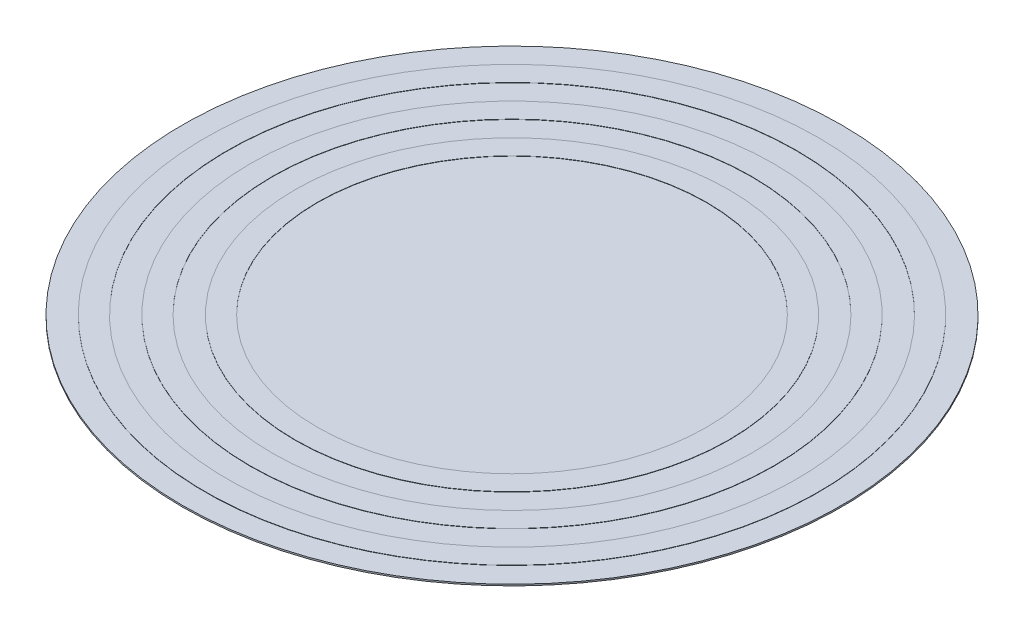
ISO-10303-21;
HEADER;
FILE_DESCRIPTION(('STEP AP214'),'2;1');
FILE_NAME('part.step','',(''),(''),'','','');
FILE_SCHEMA(('AUTOMOTIVE_DESIGN { 1 0 10303 214 1 1 1 1 }'));
ENDSEC;
DATA;
#1=APPLICATION_CONTEXT('core data for automotive mechanical design processes');
#2=APPLICATION_PROTOCOL_DEFINITION('international standard','automotive_design',2000,#1);
#3=PRODUCT_CONTEXT('',#1,'mechanical');
#4=PRODUCT('Part','Part','',(#3));
#5=PRODUCT_RELATED_PRODUCT_CATEGORY('part','',(#4));
#6=PRODUCT_DEFINITION_FORMATION('','',#4);
#7=PRODUCT_DEFINITION_CONTEXT('part definition',#1,'design');
#8=PRODUCT_DEFINITION('design','',#6,#7);
#9=PRODUCT_DEFINITION_SHAPE('','',#8);
#10=(LENGTH_UNIT() NAMED_UNIT(*) SI_UNIT(.MILLI.,.METRE.));
#11=(NAMED_UNIT(*) PLANE_ANGLE_UNIT() SI_UNIT($,.RADIAN.));
#12=(NAMED_UNIT(*) SI_UNIT($,.STERADIAN.) SOLID_ANGLE_UNIT());
#13=UNCERTAINTY_MEASURE_WITH_UNIT(LENGTH_MEASURE(1.E-05),#10,'distance_accuracy_value','');
#14=(GEOMETRIC_REPRESENTATION_CONTEXT(3) GLOBAL_UNCERTAINTY_ASSIGNED_CONTEXT((#13)) GLOBAL_UNIT_ASSIGNED_CONTEXT((#10,
#11,#12)) REPRESENTATION_CONTEXT('',''));
#15=CARTESIAN_POINT('',(0.,0.,0.));
#16=DIRECTION('',(0.,0.,1.));
#17=DIRECTION('',(1.,0.,0.));
#18=AXIS2_PLACEMENT_3D('',#15,#16,#17);
#19=CARTESIAN_POINT('',(0.,0.05,0.));
#20=DIRECTION('',(0.,1.,0.));
#21=DIRECTION('',(0.,0.,1.));
#22=AXIS2_PLACEMENT_3D('',#19,#20,#21);
#23=PLANE('',#22);
#24=CARTESIAN_POINT('',(0.,0.05,0.));
#25=DIRECTION('',(0.,1.,0.));
#26=DIRECTION('',(1.,0.,0.));
#27=AXIS2_PLACEMENT_3D('',#24,#25,#26);
#28=CIRCLE('',#27,8.7366);
#29=CARTESIAN_POINT('',(0.,0.05,-8.7366));
#30=VERTEX_POINT('',#29);
#31=EDGE_CURVE('E73',#30,#30,#28,.T.);
#32=ORIENTED_EDGE('',*,*,#31,.F.);
#33=EDGE_LOOP('',(#32));
#34=FACE_BOUND('',#33,.T.);
#35=CARTESIAN_POINT('',(0.,0.05,0.));
#36=DIRECTION('',(0.,1.,0.));
#37=DIRECTION('',(0.,0.,1.));
#38=AXIS2_PLACEMENT_3D('',#35,#36,#37);
#39=CIRCLE('',#38,9.5);
#40=CARTESIAN_POINT('',(0.,0.05,-9.5));
#41=VERTEX_POINT('',#40);
#42=EDGE_CURVE('E56',#41,#41,#39,.F.);
#43=ORIENTED_EDGE('',*,*,#42,.F.);
#44=EDGE_LOOP('',(#43));
#45=FACE_BOUND('',#44,.T.);
#46=ADVANCED_FACE('F49',(#34,#45),#23,.T.);
#47=CARTESIAN_POINT('',(0.,0.06,0.));
#48=DIRECTION('',(0.,1.,0.));
#49=DIRECTION('',(0.,0.,1.));
#50=AXIS2_PLACEMENT_3D('',#47,#48,#49);
#51=PLANE('',#50);
#52=CARTESIAN_POINT('',(0.,0.06,0.));
#53=DIRECTION('',(0.,1.,0.));
#54=DIRECTION('',(1.,0.,0.));
#55=AXIS2_PLACEMENT_3D('',#52,#53,#54);
#56=CIRCLE('',#55,8.7366);
#57=CARTESIAN_POINT('',(0.,0.06,-8.7366));
#58=VERTEX_POINT('',#57);
#59=EDGE_CURVE('E70',#58,#58,#56,.T.);
#60=ORIENTED_EDGE('',*,*,#59,.T.);
#61=EDGE_LOOP('',(#60));
#62=FACE_BOUND('',#61,.T.);
#63=CARTESIAN_POINT('',(0.,0.06,0.));
#64=DIRECTION('',(0.,1.,0.));
#65=DIRECTION('',(0.,0.,1.));
#66=AXIS2_PLACEMENT_3D('',#63,#64,#65);
#67=CIRCLE('',#66,8.);
#68=CARTESIAN_POINT('',(0.,0.06,-8.));
#69=VERTEX_POINT('',#68);
#70=EDGE_CURVE('E76',#69,#69,#67,.T.);
#71=ORIENTED_EDGE('',*,*,#70,.F.);
#72=EDGE_LOOP('',(#71));
#73=FACE_BOUND('',#72,.T.);
#74=ADVANCED_FACE('F120',(#62,#73),#51,.T.);
#75=CARTESIAN_POINT('',(0.,0.06,0.));
#76=DIRECTION('',(0.,-1.,0.));
#77=DIRECTION('',(0.,0.,-1.));
#78=AXIS2_PLACEMENT_3D('',#75,#76,#77);
#79=CYLINDRICAL_SURFACE('',#78,8.7366);
#80=CARTESIAN_POINT('',(0.,0.06,-8.7366));
#81=CARTESIAN_POINT('',(0.,0.0598958333333333,-8.7366));
#82=CARTESIAN_POINT('',(0.,0.0597916666666667,-8.7366));
#83=CARTESIAN_POINT('',(0.,0.0595833333333333,-8.7366));
#84=CARTESIAN_POINT('',(0.,0.0594791666666667,-8.7366));
#85=CARTESIAN_POINT('',(0.,0.0592708333333333,-8.7366));
#86=CARTESIAN_POINT('',(0.,0.0591666666666667,-8.7366));
#87=CARTESIAN_POINT('',(0.,0.0589583333333333,-8.7366));
#88=CARTESIAN_POINT('',(0.,0.0588541666666667,-8.7366));
#89=CARTESIAN_POINT('',(0.,0.0586458333333333,-8.7366));
#90=CARTESIAN_POINT('',(0.,0.0585416666666667,-8.7366));
#91=CARTESIAN_POINT('',(0.,0.0583333333333333,-8.7366));
#92=CARTESIAN_POINT('',(0.,0.0582291666666667,-8.7366));
#93=CARTESIAN_POINT('',(0.,0.0580208333333333,-8.7366));
#94=CARTESIAN_POINT('',(0.,0.0579166666666667,-8.7366));
#95=CARTESIAN_POINT('',(0.,0.0577083333333333,-8.7366));
#96=CARTESIAN_POINT('',(0.,0.0576041666666667,-8.7366));
#97=CARTESIAN_POINT('',(0.,0.0573958333333333,-8.7366));
#98=CARTESIAN_POINT('',(0.,0.0572916666666667,-8.7366));
#99=CARTESIAN_POINT('',(0.,0.0570833333333333,-8.7366));
#100=CARTESIAN_POINT('',(0.,0.0569791666666667,-8.7366));
#101=CARTESIAN_POINT('',(0.,0.0567708333333333,-8.7366));
#102=CARTESIAN_POINT('',(0.,0.0566666666666667,-8.7366));
#103=CARTESIAN_POINT('',(0.,0.0564583333333333,-8.7366));
#104=CARTESIAN_POINT('',(0.,0.0563541666666667,-8.7366));
#105=CARTESIAN_POINT('',(0.,0.0561458333333333,-8.7366));
#106=CARTESIAN_POINT('',(0.,0.0560416666666667,-8.7366));
#107=CARTESIAN_POINT('',(0.,0.0558333333333333,-8.7366));
#108=CARTESIAN_POINT('',(0.,0.0557291666666667,-8.7366));
#109=CARTESIAN_POINT('',(0.,0.0555208333333333,-8.7366));
#110=CARTESIAN_POINT('',(0.,0.0554166666666667,-8.7366));
#111=CARTESIAN_POINT('',(0.,0.0552083333333333,-8.7366));
#112=CARTESIAN_POINT('',(0.,0.0551041666666667,-8.7366));
#113=CARTESIAN_POINT('',(0.,0.0548958333333333,-8.7366));
#114=CARTESIAN_POINT('',(0.,0.0547916666666667,-8.7366));
#115=CARTESIAN_POINT('',(0.,0.0545833333333333,-8.7366));
#116=CARTESIAN_POINT('',(0.,0.0544791666666667,-8.7366));
#117=CARTESIAN_POINT('',(0.,0.0542708333333333,-8.7366));
#118=CARTESIAN_POINT('',(0.,0.0541666666666667,-8.7366));
#119=CARTESIAN_POINT('',(0.,0.0539583333333333,-8.7366));
#120=CARTESIAN_POINT('',(0.,0.0538541666666667,-8.7366));
#121=CARTESIAN_POINT('',(0.,0.0536458333333333,-8.7366));
#122=CARTESIAN_POINT('',(0.,0.0535416666666667,-8.7366));
#123=CARTESIAN_POINT('',(0.,0.0533333333333333,-8.7366));
#124=CARTESIAN_POINT('',(0.,0.0532291666666667,-8.7366));
#125=CARTESIAN_POINT('',(0.,0.0530208333333333,-8.7366));
#126=CARTESIAN_POINT('',(0.,0.0529166666666667,-8.7366));
#127=CARTESIAN_POINT('',(0.,0.0527083333333333,-8.7366));
#128=CARTESIAN_POINT('',(0.,0.0526041666666667,-8.7366));
#129=CARTESIAN_POINT('',(0.,0.0523958333333333,-8.7366));
#130=CARTESIAN_POINT('',(0.,0.0522916666666667,-8.7366));
#131=CARTESIAN_POINT('',(0.,0.0520833333333333,-8.7366));
#132=CARTESIAN_POINT('',(0.,0.0519791666666667,-8.7366));
#133=CARTESIAN_POINT('',(0.,0.0517708333333333,-8.7366));
#134=CARTESIAN_POINT('',(0.,0.0516666666666667,-8.7366));
#135=CARTESIAN_POINT('',(0.,0.0514583333333333,-8.7366));
#136=CARTESIAN_POINT('',(0.,0.0513541666666667,-8.7366));
#137=CARTESIAN_POINT('',(0.,0.0511458333333333,-8.7366));
#138=CARTESIAN_POINT('',(0.,0.0510416666666667,-8.7366));
#139=CARTESIAN_POINT('',(0.,0.0508333333333333,-8.7366));
#140=CARTESIAN_POINT('',(0.,0.0507291666666667,-8.7366));
#141=CARTESIAN_POINT('',(0.,0.0505208333333333,-8.7366));
#142=CARTESIAN_POINT('',(0.,0.0504166666666667,-8.7366));
#143=CARTESIAN_POINT('',(0.,0.0502083333333333,-8.7366));
#144=CARTESIAN_POINT('',(0.,0.0501041666666667,-8.7366));
#145=CARTESIAN_POINT('',(0.,0.05,-8.7366));
#146=B_SPLINE_CURVE_WITH_KNOTS('',3,(#80,#81,#82,#83,#84,#85,#86,#87,#88,#89,#90,#91,#92,#93,
#94,#95,#96,#97,#98,#99,#100,#101,#102,#103,#104,#105,#106,#107,#108,#109,#110,#111,#112,#113,
#114,#115,#116,#117,#118,#119,#120,#121,#122,#123,#124,#125,#126,#127,#128,#129,#130,#131,#132,
#133,#134,#135,#136,#137,#138,#139,#140,#141,#142,#143,#144,#145),.UNSPECIFIED.,.F.,.F.,(4,2,2,
2,2,2,2,2,2,2,2,2,2,2,2,2,2,2,2,2,2,2,2,2,2,2,2,2,2,2,2,2,4),(0.,0.000312500000000001,
0.000625000000000002,0.000937500000000002,0.00125,0.0015625,0.001875,0.00218750000000001,0.0025,
0.0028125,0.003125,0.0034375,0.00375,0.0040625,0.004375,0.00468750000000001,0.005,0.0053125,
0.005625,0.0059375,0.00625,0.0065625,0.006875,0.0071875,0.0075,0.0078125,0.008125,0.0084375,
0.00875,0.0090625,0.009375,0.0096875,0.01),.UNSPECIFIED.);
#147=EDGE_CURVE('BSEAM125',#58,#30,#146,.T.);
#148=ORIENTED_EDGE('',*,*,#59,.F.);
#149=ORIENTED_EDGE('',*,*,#31,.T.);
#150=ORIENTED_EDGE('',*,*,#147,.T.);
#151=ORIENTED_EDGE('',*,*,#147,.F.);
#152=EDGE_LOOP('',(#148,#150,#149,#151));
#153=FACE_BOUND('',#152,.T.);
#154=ADVANCED_FACE('F125',(#153),#79,.T.);
#155=CARTESIAN_POINT('',(0.,0.06,0.));
#156=DIRECTION('',(0.,-1.,0.));
#157=DIRECTION('',(0.,0.,-1.));
#158=AXIS2_PLACEMENT_3D('',#155,#156,#157);
#159=CYLINDRICAL_SURFACE('',#158,8.);
#160=CARTESIAN_POINT('',(0.,0.05,0.));
#161=DIRECTION('',(0.,1.,0.));
#162=DIRECTION('',(0.,0.,1.));
#163=AXIS2_PLACEMENT_3D('',#160,#161,#162);
#164=CIRCLE('',#163,8.);
#165=CARTESIAN_POINT('',(0.,0.05,-8.));
#166=VERTEX_POINT('',#165);
#167=EDGE_CURVE('E60',#166,#166,#164,.F.);
#168=CARTESIAN_POINT('',(0.,0.06,-8.));
#169=CARTESIAN_POINT('',(0.,0.0598958333333333,-8.));
#170=CARTESIAN_POINT('',(0.,0.0597916666666667,-8.));
#171=CARTESIAN_POINT('',(0.,0.0595833333333333,-8.));
#172=CARTESIAN_POINT('',(0.,0.0594791666666667,-8.));
#173=CARTESIAN_POINT('',(0.,0.0592708333333333,-8.));
#174=CARTESIAN_POINT('',(0.,0.0591666666666667,-8.));
#175=CARTESIAN_POINT('',(0.,0.0589583333333333,-8.));
#176=CARTESIAN_POINT('',(0.,0.0588541666666667,-8.));
#177=CARTESIAN_POINT('',(0.,0.0586458333333333,-8.));
#178=CARTESIAN_POINT('',(0.,0.0585416666666667,-8.));
#179=CARTESIAN_POINT('',(0.,0.0583333333333333,-8.));
#180=CARTESIAN_POINT('',(0.,0.0582291666666667,-8.));
#181=CARTESIAN_POINT('',(0.,0.0580208333333333,-8.));
#182=CARTESIAN_POINT('',(0.,0.0579166666666667,-8.));
#183=CARTESIAN_POINT('',(0.,0.0577083333333333,-8.));
#184=CARTESIAN_POINT('',(0.,0.0576041666666667,-8.));
#185=CARTESIAN_POINT('',(0.,0.0573958333333333,-8.));
#186=CARTESIAN_POINT('',(0.,0.0572916666666667,-8.));
#187=CARTESIAN_POINT('',(0.,0.0570833333333333,-8.));
#188=CARTESIAN_POINT('',(0.,0.0569791666666667,-8.));
#189=CARTESIAN_POINT('',(0.,0.0567708333333333,-8.));
#190=CARTESIAN_POINT('',(0.,0.0566666666666667,-8.));
#191=CARTESIAN_POINT('',(0.,0.0564583333333333,-8.));
#192=CARTESIAN_POINT('',(0.,0.0563541666666667,-8.));
#193=CARTESIAN_POINT('',(0.,0.0561458333333333,-8.));
#194=CARTESIAN_POINT('',(0.,0.0560416666666667,-8.));
#195=CARTESIAN_POINT('',(0.,0.0558333333333333,-8.));
#196=CARTESIAN_POINT('',(0.,0.0557291666666667,-8.));
#197=CARTESIAN_POINT('',(0.,0.0555208333333333,-8.));
#198=CARTESIAN_POINT('',(0.,0.0554166666666667,-8.));
#199=CARTESIAN_POINT('',(0.,0.0552083333333333,-8.));
#200=CARTESIAN_POINT('',(0.,0.0551041666666667,-8.));
#201=CARTESIAN_POINT('',(0.,0.0548958333333333,-8.));
#202=CARTESIAN_POINT('',(0.,0.0547916666666667,-8.));
#203=CARTESIAN_POINT('',(0.,0.0545833333333333,-8.));
#204=CARTESIAN_POINT('',(0.,0.0544791666666667,-8.));
#205=CARTESIAN_POINT('',(0.,0.0542708333333333,-8.));
#206=CARTESIAN_POINT('',(0.,0.0541666666666667,-8.));
#207=CARTESIAN_POINT('',(0.,0.0539583333333333,-8.));
#208=CARTESIAN_POINT('',(0.,0.0538541666666667,-8.));
#209=CARTESIAN_POINT('',(0.,0.0536458333333333,-8.));
#210=CARTESIAN_POINT('',(0.,0.0535416666666667,-8.));
#211=CARTESIAN_POINT('',(0.,0.0533333333333333,-8.));
#212=CARTESIAN_POINT('',(0.,0.0532291666666667,-8.));
#213=CARTESIAN_POINT('',(0.,0.0530208333333333,-8.));
#214=CARTESIAN_POINT('',(0.,0.0529166666666667,-8.));
#215=CARTESIAN_POINT('',(0.,0.0527083333333333,-8.));
#216=CARTESIAN_POINT('',(0.,0.0526041666666667,-8.));
#217=CARTESIAN_POINT('',(0.,0.0523958333333333,-8.));
#218=CARTESIAN_POINT('',(0.,0.0522916666666667,-8.));
#219=CARTESIAN_POINT('',(0.,0.0520833333333333,-8.));
#220=CARTESIAN_POINT('',(0.,0.0519791666666667,-8.));
#221=CARTESIAN_POINT('',(0.,0.0517708333333333,-8.));
#222=CARTESIAN_POINT('',(0.,0.0516666666666667,-8.));
#223=CARTESIAN_POINT('',(0.,0.0514583333333333,-8.));
#224=CARTESIAN_POINT('',(0.,0.0513541666666667,-8.));
#225=CARTESIAN_POINT('',(0.,0.0511458333333333,-8.));
#226=CARTESIAN_POINT('',(0.,0.0510416666666667,-8.));
#227=CARTESIAN_POINT('',(0.,0.0508333333333333,-8.));
#228=CARTESIAN_POINT('',(0.,0.0507291666666667,-8.));
#229=CARTESIAN_POINT('',(0.,0.0505208333333333,-8.));
#230=CARTESIAN_POINT('',(0.,0.0504166666666667,-8.));
#231=CARTESIAN_POINT('',(0.,0.0502083333333333,-8.));
#232=CARTESIAN_POINT('',(0.,0.0501041666666667,-8.));
#233=CARTESIAN_POINT('',(0.,0.05,-8.));
#234=B_SPLINE_CURVE_WITH_KNOTS('',3,(#168,#169,#170,#171,#172,#173,#174,#175,#176,#177,#178,
#179,#180,#181,#182,#183,#184,#185,#186,#187,#188,#189,#190,#191,#192,#193,#194,#195,#196,#197,
#198,#199,#200,#201,#202,#203,#204,#205,#206,#207,#208,#209,#210,#211,#212,#213,#214,#215,#216,
#217,#218,#219,#220,#221,#222,#223,#224,#225,#226,#227,#228,#229,#230,#231,#232,#233),
.UNSPECIFIED.,.F.,.F.,(4,2,2,2,2,2,2,2,2,2,2,2,2,2,2,2,2,2,2,2,2,2,2,2,2,2,2,2,2,2,2,2,4),(0.,
0.000312500000000001,0.000625000000000002,0.000937500000000002,0.00125,0.0015625,0.001875,
0.00218750000000001,0.0025,0.0028125,0.003125,0.0034375,0.00375,0.0040625,0.004375,
0.00468750000000001,0.005,0.0053125,0.005625,0.0059375,0.00625,0.0065625,0.006875,0.0071875,
0.0075,0.0078125,0.008125,0.0084375,0.00875,0.0090625,0.009375,0.0096875,0.01),.UNSPECIFIED.);
#235=EDGE_CURVE('BSEAM133',#69,#166,#234,.T.);
#236=ORIENTED_EDGE('',*,*,#70,.T.);
#237=ORIENTED_EDGE('',*,*,#167,.T.);
#238=ORIENTED_EDGE('',*,*,#235,.T.);
#239=ORIENTED_EDGE('',*,*,#235,.F.);
#240=EDGE_LOOP('',(#236,#238,#237,#239));
#241=FACE_BOUND('',#240,.T.);
#242=ADVANCED_FACE('F133',(#241),#159,.F.);
#243=CARTESIAN_POINT('',(0.,0.05,0.));
#244=DIRECTION('',(0.,1.,0.));
#245=DIRECTION('',(1.,0.,0.));
#246=AXIS2_PLACEMENT_3D('',#243,#244,#245);
#247=CIRCLE('',#246,7.2366);
#248=CARTESIAN_POINT('',(0.,0.05,-7.2366));
#249=VERTEX_POINT('',#248);
#250=EDGE_CURVE('E91',#249,#249,#247,.T.);
#251=ORIENTED_EDGE('',*,*,#250,.F.);
#252=EDGE_LOOP('',(#251));
#253=FACE_BOUND('',#252,.T.);
#254=ORIENTED_EDGE('',*,*,#167,.F.);
#255=EDGE_LOOP('',(#254));
#256=FACE_BOUND('',#255,.T.);
#257=ADVANCED_FACE('F117',(#253,#256),#23,.T.);
#258=CARTESIAN_POINT('',(0.,0.06,0.));
#259=DIRECTION('',(0.,1.,0.));
#260=DIRECTION('',(0.,0.,1.));
#261=AXIS2_PLACEMENT_3D('',#258,#259,#260);
#262=PLANE('',#261);
#263=CARTESIAN_POINT('',(0.,0.06,0.));
#264=DIRECTION('',(0.,1.,0.));
#265=DIRECTION('',(1.,0.,0.));
#266=AXIS2_PLACEMENT_3D('',#263,#264,#265);
#267=CIRCLE('',#266,10.2366);
#268=CARTESIAN_POINT('',(0.,0.06,-10.2366));
#269=VERTEX_POINT('',#268);
#270=EDGE_CURVE('E81',#269,#269,#267,.T.);
#271=ORIENTED_EDGE('',*,*,#270,.T.);
#272=EDGE_LOOP('',(#271));
#273=FACE_BOUND('',#272,.T.);
#274=CARTESIAN_POINT('',(0.,0.06,0.));
#275=DIRECTION('',(0.,1.,0.));
#276=DIRECTION('',(0.,0.,1.));
#277=AXIS2_PLACEMENT_3D('',#274,#275,#276);
#278=CIRCLE('',#277,9.5);
#279=CARTESIAN_POINT('',(0.,0.06,-9.5));
#280=VERTEX_POINT('',#279);
#281=EDGE_CURVE('E85',#280,#280,#278,.T.);
#282=ORIENTED_EDGE('',*,*,#281,.F.);
#283=EDGE_LOOP('',(#282));
#284=FACE_BOUND('',#283,.T.);
#285=ADVANCED_FACE('F132',(#273,#284),#262,.T.);
#286=CARTESIAN_POINT('',(0.,0.06,0.));
#287=DIRECTION('',(0.,-1.,0.));
#288=DIRECTION('',(0.,0.,-1.));
#289=AXIS2_PLACEMENT_3D('',#286,#287,#288);
#290=CYLINDRICAL_SURFACE('',#289,10.2366);
#291=CARTESIAN_POINT('',(0.,0.05,0.));
#292=DIRECTION('',(0.,1.,0.));
#293=DIRECTION('',(1.,0.,0.));
#294=AXIS2_PLACEMENT_3D('',#291,#292,#293);
#295=CIRCLE('',#294,10.2366);
#296=CARTESIAN_POINT('',(0.,0.05,-10.2366));
#297=VERTEX_POINT('',#296);
#298=EDGE_CURVE('E82',#297,#297,#295,.T.);
#299=CARTESIAN_POINT('',(0.,0.06,-10.2366));
#300=CARTESIAN_POINT('',(0.,0.0598958333333333,-10.2366));
#301=CARTESIAN_POINT('',(0.,0.0597916666666667,-10.2366));
#302=CARTESIAN_POINT('',(0.,0.0595833333333333,-10.2366));
#303=CARTESIAN_POINT('',(0.,0.0594791666666667,-10.2366));
#304=CARTESIAN_POINT('',(0.,0.0592708333333333,-10.2366));
#305=CARTESIAN_POINT('',(0.,0.0591666666666667,-10.2366));
#306=CARTESIAN_POINT('',(0.,0.0589583333333333,-10.2366));
#307=CARTESIAN_POINT('',(0.,0.0588541666666667,-10.2366));
#308=CARTESIAN_POINT('',(0.,0.0586458333333333,-10.2366));
#309=CARTESIAN_POINT('',(0.,0.0585416666666667,-10.2366));
#310=CARTESIAN_POINT('',(0.,0.0583333333333333,-10.2366));
#311=CARTESIAN_POINT('',(0.,0.0582291666666667,-10.2366));
#312=CARTESIAN_POINT('',(0.,0.0580208333333333,-10.2366));
#313=CARTESIAN_POINT('',(0.,0.0579166666666667,-10.2366));
#314=CARTESIAN_POINT('',(0.,0.0577083333333333,-10.2366));
#315=CARTESIAN_POINT('',(0.,0.0576041666666667,-10.2366));
#316=CARTESIAN_POINT('',(0.,0.0573958333333333,-10.2366));
#317=CARTESIAN_POINT('',(0.,0.0572916666666667,-10.2366));
#318=CARTESIAN_POINT('',(0.,0.0570833333333333,-10.2366));
#319=CARTESIAN_POINT('',(0.,0.0569791666666667,-10.2366));
#320=CARTESIAN_POINT('',(0.,0.0567708333333333,-10.2366));
#321=CARTESIAN_POINT('',(0.,0.0566666666666667,-10.2366));
#322=CARTESIAN_POINT('',(0.,0.0564583333333333,-10.2366));
#323=CARTESIAN_POINT('',(0.,0.0563541666666667,-10.2366));
#324=CARTESIAN_POINT('',(0.,0.0561458333333333,-10.2366));
#325=CARTESIAN_POINT('',(0.,0.0560416666666667,-10.2366));
#326=CARTESIAN_POINT('',(0.,0.0558333333333333,-10.2366));
#327=CARTESIAN_POINT('',(0.,0.0557291666666667,-10.2366));
#328=CARTESIAN_POINT('',(0.,0.0555208333333333,-10.2366));
#329=CARTESIAN_POINT('',(0.,0.0554166666666667,-10.2366));
#330=CARTESIAN_POINT('',(0.,0.0552083333333333,-10.2366));
#331=CARTESIAN_POINT('',(0.,0.0551041666666667,-10.2366));
#332=CARTESIAN_POINT('',(0.,0.0548958333333333,-10.2366));
#333=CARTESIAN_POINT('',(0.,0.0547916666666667,-10.2366));
#334=CARTESIAN_POINT('',(0.,0.0545833333333333,-10.2366));
#335=CARTESIAN_POINT('',(0.,0.0544791666666667,-10.2366));
#336=CARTESIAN_POINT('',(0.,0.0542708333333333,-10.2366));
#337=CARTESIAN_POINT('',(0.,0.0541666666666667,-10.2366));
#338=CARTESIAN_POINT('',(0.,0.0539583333333333,-10.2366));
#339=CARTESIAN_POINT('',(0.,0.0538541666666667,-10.2366));
#340=CARTESIAN_POINT('',(0.,0.0536458333333333,-10.2366));
#341=CARTESIAN_POINT('',(0.,0.0535416666666667,-10.2366));
#342=CARTESIAN_POINT('',(0.,0.0533333333333333,-10.2366));
#343=CARTESIAN_POINT('',(0.,0.0532291666666667,-10.2366));
#344=CARTESIAN_POINT('',(0.,0.0530208333333333,-10.2366));
#345=CARTESIAN_POINT('',(0.,0.0529166666666667,-10.2366));
#346=CARTESIAN_POINT('',(0.,0.0527083333333333,-10.2366));
#347=CARTESIAN_POINT('',(0.,0.0526041666666667,-10.2366));
#348=CARTESIAN_POINT('',(0.,0.0523958333333333,-10.2366));
#349=CARTESIAN_POINT('',(0.,0.0522916666666667,-10.2366));
#350=CARTESIAN_POINT('',(0.,0.0520833333333333,-10.2366));
#351=CARTESIAN_POINT('',(0.,0.0519791666666667,-10.2366));
#352=CARTESIAN_POINT('',(0.,0.0517708333333333,-10.2366));
#353=CARTESIAN_POINT('',(0.,0.0516666666666667,-10.2366));
#354=CARTESIAN_POINT('',(0.,0.0514583333333333,-10.2366));
#355=CARTESIAN_POINT('',(0.,0.0513541666666667,-10.2366));
#356=CARTESIAN_POINT('',(0.,0.0511458333333333,-10.2366));
#357=CARTESIAN_POINT('',(0.,0.0510416666666667,-10.2366));
#358=CARTESIAN_POINT('',(0.,0.0508333333333333,-10.2366));
#359=CARTESIAN_POINT('',(0.,0.0507291666666667,-10.2366));
#360=CARTESIAN_POINT('',(0.,0.0505208333333333,-10.2366));
#361=CARTESIAN_POINT('',(0.,0.0504166666666667,-10.2366));
#362=CARTESIAN_POINT('',(0.,0.0502083333333333,-10.2366));
#363=CARTESIAN_POINT('',(0.,0.0501041666666667,-10.2366));
#364=CARTESIAN_POINT('',(0.,0.05,-10.2366));
#365=B_SPLINE_CURVE_WITH_KNOTS('',3,(#299,#300,#301,#302,#303,#304,#305,#306,#307,#308,#309,
#310,#311,#312,#313,#314,#315,#316,#317,#318,#319,#320,#321,#322,#323,#324,#325,#326,#327,#328,
#329,#330,#331,#332,#333,#334,#335,#336,#337,#338,#339,#340,#341,#342,#343,#344,#345,#346,#347,
#348,#349,#350,#351,#352,#353,#354,#355,#356,#357,#358,#359,#360,#361,#362,#363,#364),
.UNSPECIFIED.,.F.,.F.,(4,2,2,2,2,2,2,2,2,2,2,2,2,2,2,2,2,2,2,2,2,2,2,2,2,2,2,2,2,2,2,2,4),(0.,
0.000312500000000001,0.000625000000000002,0.000937500000000002,0.00125,0.0015625,0.001875,
0.00218750000000001,0.0025,0.0028125,0.003125,0.0034375,0.00375,0.0040625,0.004375,
0.00468750000000001,0.005,0.0053125,0.005625,0.0059375,0.00625,0.0065625,0.006875,0.0071875,
0.0075,0.0078125,0.008125,0.0084375,0.00875,0.0090625,0.009375,0.0096875,0.01),.UNSPECIFIED.);
#366=EDGE_CURVE('BSEAM180',#269,#297,#365,.T.);
#367=ORIENTED_EDGE('',*,*,#270,.F.);
#368=ORIENTED_EDGE('',*,*,#298,.T.);
#369=ORIENTED_EDGE('',*,*,#366,.T.);
#370=ORIENTED_EDGE('',*,*,#366,.F.);
#371=EDGE_LOOP('',(#367,#369,#368,#370));
#372=FACE_BOUND('',#371,.T.);
#373=ADVANCED_FACE('F180',(#372),#290,.T.);
#374=CARTESIAN_POINT('',(0.,0.06,0.));
#375=DIRECTION('',(0.,-1.,0.));
#376=DIRECTION('',(0.,0.,-1.));
#377=AXIS2_PLACEMENT_3D('',#374,#375,#376);
#378=CYLINDRICAL_SURFACE('',#377,9.5);
#379=CARTESIAN_POINT('',(0.,0.06,-9.5));
#380=CARTESIAN_POINT('',(0.,0.0598958333333333,-9.5));
#381=CARTESIAN_POINT('',(0.,0.0597916666666667,-9.5));
#382=CARTESIAN_POINT('',(0.,0.0595833333333333,-9.5));
#383=CARTESIAN_POINT('',(0.,0.0594791666666667,-9.5));
#384=CARTESIAN_POINT('',(0.,0.0592708333333333,-9.5));
#385=CARTESIAN_POINT('',(0.,0.0591666666666667,-9.5));
#386=CARTESIAN_POINT('',(0.,0.0589583333333333,-9.5));
#387=CARTESIAN_POINT('',(0.,0.0588541666666667,-9.5));
#388=CARTESIAN_POINT('',(0.,0.0586458333333333,-9.5));
#389=CARTESIAN_POINT('',(0.,0.0585416666666667,-9.5));
#390=CARTESIAN_POINT('',(0.,0.0583333333333333,-9.5));
#391=CARTESIAN_POINT('',(0.,0.0582291666666667,-9.5));
#392=CARTESIAN_POINT('',(0.,0.0580208333333333,-9.5));
#393=CARTESIAN_POINT('',(0.,0.0579166666666667,-9.5));
#394=CARTESIAN_POINT('',(0.,0.0577083333333333,-9.5));
#395=CARTESIAN_POINT('',(0.,0.0576041666666667,-9.5));
#396=CARTESIAN_POINT('',(0.,0.0573958333333333,-9.5));
#397=CARTESIAN_POINT('',(0.,0.0572916666666667,-9.5));
#398=CARTESIAN_POINT('',(0.,0.0570833333333333,-9.5));
#399=CARTESIAN_POINT('',(0.,0.0569791666666667,-9.5));
#400=CARTESIAN_POINT('',(0.,0.0567708333333333,-9.5));
#401=CARTESIAN_POINT('',(0.,0.0566666666666667,-9.5));
#402=CARTESIAN_POINT('',(0.,0.0564583333333333,-9.5));
#403=CARTESIAN_POINT('',(0.,0.0563541666666667,-9.5));
#404=CARTESIAN_POINT('',(0.,0.0561458333333333,-9.5));
#405=CARTESIAN_POINT('',(0.,0.0560416666666667,-9.5));
#406=CARTESIAN_POINT('',(0.,0.0558333333333333,-9.5));
#407=CARTESIAN_POINT('',(0.,0.0557291666666667,-9.5));
#408=CARTESIAN_POINT('',(0.,0.0555208333333333,-9.5));
#409=CARTESIAN_POINT('',(0.,0.0554166666666667,-9.5));
#410=CARTESIAN_POINT('',(0.,0.0552083333333333,-9.5));
#411=CARTESIAN_POINT('',(0.,0.0551041666666667,-9.5));
#412=CARTESIAN_POINT('',(0.,0.0548958333333333,-9.5));
#413=CARTESIAN_POINT('',(0.,0.0547916666666667,-9.5));
#414=CARTESIAN_POINT('',(0.,0.0545833333333333,-9.5));
#415=CARTESIAN_POINT('',(0.,0.0544791666666667,-9.5));
#416=CARTESIAN_POINT('',(0.,0.0542708333333333,-9.5));
#417=CARTESIAN_POINT('',(0.,0.0541666666666667,-9.5));
#418=CARTESIAN_POINT('',(0.,0.0539583333333333,-9.5));
#419=CARTESIAN_POINT('',(0.,0.0538541666666667,-9.5));
#420=CARTESIAN_POINT('',(0.,0.0536458333333333,-9.5));
#421=CARTESIAN_POINT('',(0.,0.0535416666666667,-9.5));
#422=CARTESIAN_POINT('',(0.,0.0533333333333333,-9.5));
#423=CARTESIAN_POINT('',(0.,0.0532291666666667,-9.5));
#424=CARTESIAN_POINT('',(0.,0.0530208333333333,-9.5));
#425=CARTESIAN_POINT('',(0.,0.0529166666666667,-9.5));
#426=CARTESIAN_POINT('',(0.,0.0527083333333333,-9.5));
#427=CARTESIAN_POINT('',(0.,0.0526041666666667,-9.5));
#428=CARTESIAN_POINT('',(0.,0.0523958333333333,-9.5));
#429=CARTESIAN_POINT('',(0.,0.0522916666666667,-9.5));
#430=CARTESIAN_POINT('',(0.,0.0520833333333333,-9.5));
#431=CARTESIAN_POINT('',(0.,0.0519791666666667,-9.5));
#432=CARTESIAN_POINT('',(0.,0.0517708333333333,-9.5));
#433=CARTESIAN_POINT('',(0.,0.0516666666666667,-9.5));
#434=CARTESIAN_POINT('',(0.,0.0514583333333333,-9.5));
#435=CARTESIAN_POINT('',(0.,0.0513541666666667,-9.5));
#436=CARTESIAN_POINT('',(0.,0.0511458333333333,-9.5));
#437=CARTESIAN_POINT('',(0.,0.0510416666666667,-9.5));
#438=CARTESIAN_POINT('',(0.,0.0508333333333333,-9.5));
#439=CARTESIAN_POINT('',(0.,0.0507291666666667,-9.5));
#440=CARTESIAN_POINT('',(0.,0.0505208333333333,-9.5));
#441=CARTESIAN_POINT('',(0.,0.0504166666666667,-9.5));
#442=CARTESIAN_POINT('',(0.,0.0502083333333333,-9.5));
#443=CARTESIAN_POINT('',(0.,0.0501041666666667,-9.5));
#444=CARTESIAN_POINT('',(0.,0.05,-9.5));
#445=B_SPLINE_CURVE_WITH_KNOTS('',3,(#379,#380,#381,#382,#383,#384,#385,#386,#387,#388,#389,
#390,#391,#392,#393,#394,#395,#396,#397,#398,#399,#400,#401,#402,#403,#404,#405,#406,#407,#408,
#409,#410,#411,#412,#413,#414,#415,#416,#417,#418,#419,#420,#421,#422,#423,#424,#425,#426,#427,
#428,#429,#430,#431,#432,#433,#434,#435,#436,#437,#438,#439,#440,#441,#442,#443,#444),
.UNSPECIFIED.,.F.,.F.,(4,2,2,2,2,2,2,2,2,2,2,2,2,2,2,2,2,2,2,2,2,2,2,2,2,2,2,2,2,2,2,2,4),(0.,
0.000312499999999994,0.000624999999999995,0.000937499999999996,0.00125,0.0015625,0.001875,
0.0021875,0.00249999999999999,0.00281249999999999,0.00312499999999999,0.0034375,0.00375,
0.0040625,0.004375,0.0046875,0.00499999999999999,0.00531249999999999,0.00562499999999999,
0.00593749999999999,0.00625,0.0065625,0.006875,0.00718749999999999,0.00749999999999999,
0.00781249999999999,0.00812499999999999,0.0084375,0.00875,0.0090625,0.009375,
0.00968749999999999,0.00999999999999999),.UNSPECIFIED.);
#446=EDGE_CURVE('BSEAM174',#280,#41,#445,.T.);
#447=ORIENTED_EDGE('',*,*,#281,.T.);
#448=ORIENTED_EDGE('',*,*,#42,.T.);
#449=ORIENTED_EDGE('',*,*,#446,.T.);
#450=ORIENTED_EDGE('',*,*,#446,.F.);
#451=EDGE_LOOP('',(#447,#449,#448,#450));
#452=FACE_BOUND('',#451,.T.);
#453=ADVANCED_FACE('F174',(#452),#378,.F.);
#454=CARTESIAN_POINT('',(0.,0.,0.));
#455=DIRECTION('',(0.,1.,0.));
#456=DIRECTION('',(0.,0.,1.));
#457=AXIS2_PLACEMENT_3D('',#454,#455,#456);
#458=PLANE('',#457);
#459=CARTESIAN_POINT('',(0.,0.,0.));
#460=DIRECTION('',(0.,1.,0.));
#461=DIRECTION('',(0.,0.,1.));
#462=AXIS2_PLACEMENT_3D('',#459,#460,#461);
#463=CIRCLE('',#462,11.);
#464=CARTESIAN_POINT('',(0.,0.,11.));
#465=VERTEX_POINT('',#464);
#466=EDGE_CURVE('E67',#465,#465,#463,.T.);
#467=ORIENTED_EDGE('',*,*,#466,.F.);
#468=EDGE_LOOP('',(#467));
#469=FACE_BOUND('',#468,.T.);
#470=ADVANCED_FACE('F179',(#469),#458,.F.);
#471=CARTESIAN_POINT('',(0.,0.05,0.));
#472=DIRECTION('',(0.,-1.,0.));
#473=DIRECTION('',(0.,0.,-1.));
#474=AXIS2_PLACEMENT_3D('',#471,#472,#473);
#475=CYLINDRICAL_SURFACE('',#474,11.);
#476=CARTESIAN_POINT('',(0.,0.05,0.));
#477=DIRECTION('',(0.,1.,0.));
#478=DIRECTION('',(0.,0.,1.));
#479=AXIS2_PLACEMENT_3D('',#476,#477,#478);
#480=CIRCLE('',#479,11.);
#481=CARTESIAN_POINT('',(0.,0.05,11.));
#482=VERTEX_POINT('',#481);
#483=EDGE_CURVE('E64',#482,#482,#480,.T.);
#484=ORIENTED_EDGE('',*,*,#483,.F.);
#485=EDGE_LOOP('',(#484));
#486=FACE_BOUND('',#485,.T.);
#487=ORIENTED_EDGE('',*,*,#466,.T.);
#488=EDGE_LOOP('',(#487));
#489=FACE_BOUND('',#488,.T.);
#490=ADVANCED_FACE('F51',(#486,#489),#475,.T.);
#491=ORIENTED_EDGE('',*,*,#298,.F.);
#492=EDGE_LOOP('',(#491));
#493=FACE_BOUND('',#492,.T.);
#494=ORIENTED_EDGE('',*,*,#483,.T.);
#495=EDGE_LOOP('',(#494));
#496=FACE_BOUND('',#495,.T.);
#497=ADVANCED_FACE('F105',(#493,#496),#23,.T.);
#498=CARTESIAN_POINT('',(0.,0.06,0.));
#499=DIRECTION('',(0.,1.,0.));
#500=DIRECTION('',(0.,0.,1.));
#501=AXIS2_PLACEMENT_3D('',#498,#499,#500);
#502=PLANE('',#501);
#503=CARTESIAN_POINT('',(0.,0.06,0.));
#504=DIRECTION('',(0.,1.,0.));
#505=DIRECTION('',(1.,0.,0.));
#506=AXIS2_PLACEMENT_3D('',#503,#504,#505);
#507=CIRCLE('',#506,7.2366);
#508=CARTESIAN_POINT('',(0.,0.06,-7.2366));
#509=VERTEX_POINT('',#508);
#510=EDGE_CURVE('E90',#509,#509,#507,.T.);
#511=ORIENTED_EDGE('',*,*,#510,.T.);
#512=EDGE_LOOP('',(#511));
#513=FACE_BOUND('',#512,.T.);
#514=CARTESIAN_POINT('',(0.,0.06,0.));
#515=DIRECTION('',(0.,1.,0.));
#516=DIRECTION('',(0.,0.,1.));
#517=AXIS2_PLACEMENT_3D('',#514,#515,#516);
#518=CIRCLE('',#517,6.5);
#519=CARTESIAN_POINT('',(0.,0.06,-6.5));
#520=VERTEX_POINT('',#519);
#521=EDGE_CURVE('E94',#520,#520,#518,.T.);
#522=ORIENTED_EDGE('',*,*,#521,.F.);
#523=EDGE_LOOP('',(#522));
#524=FACE_BOUND('',#523,.T.);
#525=ADVANCED_FACE('F102',(#513,#524),#502,.T.);
#526=CARTESIAN_POINT('',(0.,0.06,0.));
#527=DIRECTION('',(0.,-1.,0.));
#528=DIRECTION('',(0.,0.,-1.));
#529=AXIS2_PLACEMENT_3D('',#526,#527,#528);
#530=CYLINDRICAL_SURFACE('',#529,7.2366);
#531=CARTESIAN_POINT('',(0.,0.06,-7.2366));
#532=CARTESIAN_POINT('',(0.,0.0598958333333333,-7.2366));
#533=CARTESIAN_POINT('',(0.,0.0597916666666667,-7.2366));
#534=CARTESIAN_POINT('',(0.,0.0595833333333333,-7.2366));
#535=CARTESIAN_POINT('',(0.,0.0594791666666667,-7.2366));
#536=CARTESIAN_POINT('',(0.,0.0592708333333333,-7.2366));
#537=CARTESIAN_POINT('',(0.,0.0591666666666667,-7.2366));
#538=CARTESIAN_POINT('',(0.,0.0589583333333333,-7.2366));
#539=CARTESIAN_POINT('',(0.,0.0588541666666667,-7.2366));
#540=CARTESIAN_POINT('',(0.,0.0586458333333333,-7.2366));
#541=CARTESIAN_POINT('',(0.,0.0585416666666667,-7.2366));
#542=CARTESIAN_POINT('',(0.,0.0583333333333333,-7.2366));
#543=CARTESIAN_POINT('',(0.,0.0582291666666667,-7.2366));
#544=CARTESIAN_POINT('',(0.,0.0580208333333333,-7.2366));
#545=CARTESIAN_POINT('',(0.,0.0579166666666667,-7.2366));
#546=CARTESIAN_POINT('',(0.,0.0577083333333333,-7.2366));
#547=CARTESIAN_POINT('',(0.,0.0576041666666667,-7.2366));
#548=CARTESIAN_POINT('',(0.,0.0573958333333333,-7.2366));
#549=CARTESIAN_POINT('',(0.,0.0572916666666667,-7.2366));
#550=CARTESIAN_POINT('',(0.,0.0570833333333333,-7.2366));
#551=CARTESIAN_POINT('',(0.,0.0569791666666667,-7.2366));
#552=CARTESIAN_POINT('',(0.,0.0567708333333333,-7.2366));
#553=CARTESIAN_POINT('',(0.,0.0566666666666667,-7.2366));
#554=CARTESIAN_POINT('',(0.,0.0564583333333333,-7.2366));
#555=CARTESIAN_POINT('',(0.,0.0563541666666667,-7.2366));
#556=CARTESIAN_POINT('',(0.,0.0561458333333333,-7.2366));
#557=CARTESIAN_POINT('',(0.,0.0560416666666667,-7.2366));
#558=CARTESIAN_POINT('',(0.,0.0558333333333333,-7.2366));
#559=CARTESIAN_POINT('',(0.,0.0557291666666667,-7.2366));
#560=CARTESIAN_POINT('',(0.,0.0555208333333333,-7.2366));
#561=CARTESIAN_POINT('',(0.,0.0554166666666667,-7.2366));
#562=CARTESIAN_POINT('',(0.,0.0552083333333333,-7.2366));
#563=CARTESIAN_POINT('',(0.,0.0551041666666667,-7.2366));
#564=CARTESIAN_POINT('',(0.,0.0548958333333333,-7.2366));
#565=CARTESIAN_POINT('',(0.,0.0547916666666667,-7.2366));
#566=CARTESIAN_POINT('',(0.,0.0545833333333333,-7.2366));
#567=CARTESIAN_POINT('',(0.,0.0544791666666667,-7.2366));
#568=CARTESIAN_POINT('',(0.,0.0542708333333333,-7.2366));
#569=CARTESIAN_POINT('',(0.,0.0541666666666667,-7.2366));
#570=CARTESIAN_POINT('',(0.,0.0539583333333333,-7.2366));
#571=CARTESIAN_POINT('',(0.,0.0538541666666667,-7.2366));
#572=CARTESIAN_POINT('',(0.,0.0536458333333333,-7.2366));
#573=CARTESIAN_POINT('',(0.,0.0535416666666667,-7.2366));
#574=CARTESIAN_POINT('',(0.,0.0533333333333333,-7.2366));
#575=CARTESIAN_POINT('',(0.,0.0532291666666667,-7.2366));
#576=CARTESIAN_POINT('',(0.,0.0530208333333333,-7.2366));
#577=CARTESIAN_POINT('',(0.,0.0529166666666667,-7.2366));
#578=CARTESIAN_POINT('',(0.,0.0527083333333333,-7.2366));
#579=CARTESIAN_POINT('',(0.,0.0526041666666667,-7.2366));
#580=CARTESIAN_POINT('',(0.,0.0523958333333333,-7.2366));
#581=CARTESIAN_POINT('',(0.,0.0522916666666667,-7.2366));
#582=CARTESIAN_POINT('',(0.,0.0520833333333333,-7.2366));
#583=CARTESIAN_POINT('',(0.,0.0519791666666667,-7.2366));
#584=CARTESIAN_POINT('',(0.,0.0517708333333333,-7.2366));
#585=CARTESIAN_POINT('',(0.,0.0516666666666667,-7.2366));
#586=CARTESIAN_POINT('',(0.,0.0514583333333333,-7.2366));
#587=CARTESIAN_POINT('',(0.,0.0513541666666667,-7.2366));
#588=CARTESIAN_POINT('',(0.,0.0511458333333333,-7.2366));
#589=CARTESIAN_POINT('',(0.,0.0510416666666667,-7.2366));
#590=CARTESIAN_POINT('',(0.,0.0508333333333333,-7.2366));
#591=CARTESIAN_POINT('',(0.,0.0507291666666667,-7.2366));
#592=CARTESIAN_POINT('',(0.,0.0505208333333333,-7.2366));
#593=CARTESIAN_POINT('',(0.,0.0504166666666667,-7.2366));
#594=CARTESIAN_POINT('',(0.,0.0502083333333333,-7.2366));
#595=CARTESIAN_POINT('',(0.,0.0501041666666667,-7.2366));
#596=CARTESIAN_POINT('',(0.,0.05,-7.2366));
#597=B_SPLINE_CURVE_WITH_KNOTS('',3,(#531,#532,#533,#534,#535,#536,#537,#538,#539,#540,#541,
#542,#543,#544,#545,#546,#547,#548,#549,#550,#551,#552,#553,#554,#555,#556,#557,#558,#559,#560,
#561,#562,#563,#564,#565,#566,#567,#568,#569,#570,#571,#572,#573,#574,#575,#576,#577,#578,#579,
#580,#581,#582,#583,#584,#585,#586,#587,#588,#589,#590,#591,#592,#593,#594,#595,#596),
.UNSPECIFIED.,.F.,.F.,(4,2,2,2,2,2,2,2,2,2,2,2,2,2,2,2,2,2,2,2,2,2,2,2,2,2,2,2,2,2,2,2,4),(0.,
0.000312499999999994,0.000624999999999995,0.000937499999999996,0.00125,0.0015625,0.001875,
0.0021875,0.00249999999999999,0.00281249999999999,0.00312499999999999,0.0034375,0.00375,
0.0040625,0.004375,0.0046875,0.00499999999999999,0.00531249999999999,0.00562499999999999,
0.00593749999999999,0.00625,0.0065625,0.006875,0.00718749999999999,0.00749999999999999,
0.00781249999999999,0.00812499999999999,0.0084375,0.00875,0.0090625,0.009375,
0.00968749999999999,0.00999999999999999),.UNSPECIFIED.);
#598=EDGE_CURVE('BSEAM104',#509,#249,#597,.T.);
#599=ORIENTED_EDGE('',*,*,#510,.F.);
#600=ORIENTED_EDGE('',*,*,#250,.T.);
#601=ORIENTED_EDGE('',*,*,#598,.T.);
#602=ORIENTED_EDGE('',*,*,#598,.F.);
#603=EDGE_LOOP('',(#599,#601,#600,#602));
#604=FACE_BOUND('',#603,.T.);
#605=ADVANCED_FACE('F104',(#604),#530,.T.);
#606=CARTESIAN_POINT('',(0.,0.06,0.));
#607=DIRECTION('',(0.,-1.,0.));
#608=DIRECTION('',(0.,0.,-1.));
#609=AXIS2_PLACEMENT_3D('',#606,#607,#608);
#610=CYLINDRICAL_SURFACE('',#609,6.5);
#611=CARTESIAN_POINT('',(0.,0.05,0.));
#612=DIRECTION('',(0.,1.,0.));
#613=DIRECTION('',(0.,0.,1.));
#614=AXIS2_PLACEMENT_3D('',#611,#612,#613);
#615=CIRCLE('',#614,6.5);
#616=CARTESIAN_POINT('',(0.,0.05,-6.5));
#617=VERTEX_POINT('',#616);
#618=EDGE_CURVE('E11',#617,#617,#615,.F.);
#619=CARTESIAN_POINT('',(0.,0.06,-6.5));
#620=CARTESIAN_POINT('',(0.,0.0598958333333333,-6.5));
#621=CARTESIAN_POINT('',(0.,0.0597916666666667,-6.5));
#622=CARTESIAN_POINT('',(0.,0.0595833333333333,-6.5));
#623=CARTESIAN_POINT('',(0.,0.0594791666666667,-6.5));
#624=CARTESIAN_POINT('',(0.,0.0592708333333333,-6.5));
#625=CARTESIAN_POINT('',(0.,0.0591666666666667,-6.5));
#626=CARTESIAN_POINT('',(0.,0.0589583333333333,-6.5));
#627=CARTESIAN_POINT('',(0.,0.0588541666666667,-6.5));
#628=CARTESIAN_POINT('',(0.,0.0586458333333333,-6.5));
#629=CARTESIAN_POINT('',(0.,0.0585416666666667,-6.5));
#630=CARTESIAN_POINT('',(0.,0.0583333333333333,-6.5));
#631=CARTESIAN_POINT('',(0.,0.0582291666666667,-6.5));
#632=CARTESIAN_POINT('',(0.,0.0580208333333333,-6.5));
#633=CARTESIAN_POINT('',(0.,0.0579166666666667,-6.5));
#634=CARTESIAN_POINT('',(0.,0.0577083333333333,-6.5));
#635=CARTESIAN_POINT('',(0.,0.0576041666666667,-6.5));
#636=CARTESIAN_POINT('',(0.,0.0573958333333333,-6.5));
#637=CARTESIAN_POINT('',(0.,0.0572916666666667,-6.5));
#638=CARTESIAN_POINT('',(0.,0.0570833333333333,-6.5));
#639=CARTESIAN_POINT('',(0.,0.0569791666666667,-6.5));
#640=CARTESIAN_POINT('',(0.,0.0567708333333333,-6.5));
#641=CARTESIAN_POINT('',(0.,0.0566666666666667,-6.5));
#642=CARTESIAN_POINT('',(0.,0.0564583333333333,-6.5));
#643=CARTESIAN_POINT('',(0.,0.0563541666666667,-6.5));
#644=CARTESIAN_POINT('',(0.,0.0561458333333333,-6.5));
#645=CARTESIAN_POINT('',(0.,0.0560416666666667,-6.5));
#646=CARTESIAN_POINT('',(0.,0.0558333333333333,-6.5));
#647=CARTESIAN_POINT('',(0.,0.0557291666666667,-6.5));
#648=CARTESIAN_POINT('',(0.,0.0555208333333333,-6.5));
#649=CARTESIAN_POINT('',(0.,0.0554166666666667,-6.5));
#650=CARTESIAN_POINT('',(0.,0.0552083333333333,-6.5));
#651=CARTESIAN_POINT('',(0.,0.0551041666666667,-6.5));
#652=CARTESIAN_POINT('',(0.,0.0548958333333333,-6.5));
#653=CARTESIAN_POINT('',(0.,0.0547916666666667,-6.5));
#654=CARTESIAN_POINT('',(0.,0.0545833333333333,-6.5));
#655=CARTESIAN_POINT('',(0.,0.0544791666666667,-6.5));
#656=CARTESIAN_POINT('',(0.,0.0542708333333333,-6.5));
#657=CARTESIAN_POINT('',(0.,0.0541666666666667,-6.5));
#658=CARTESIAN_POINT('',(0.,0.0539583333333333,-6.5));
#659=CARTESIAN_POINT('',(0.,0.0538541666666667,-6.5));
#660=CARTESIAN_POINT('',(0.,0.0536458333333333,-6.5));
#661=CARTESIAN_POINT('',(0.,0.0535416666666667,-6.5));
#662=CARTESIAN_POINT('',(0.,0.0533333333333333,-6.5));
#663=CARTESIAN_POINT('',(0.,0.0532291666666667,-6.5));
#664=CARTESIAN_POINT('',(0.,0.0530208333333333,-6.5));
#665=CARTESIAN_POINT('',(0.,0.0529166666666667,-6.5));
#666=CARTESIAN_POINT('',(0.,0.0527083333333333,-6.5));
#667=CARTESIAN_POINT('',(0.,0.0526041666666667,-6.5));
#668=CARTESIAN_POINT('',(0.,0.0523958333333333,-6.5));
#669=CARTESIAN_POINT('',(0.,0.0522916666666667,-6.5));
#670=CARTESIAN_POINT('',(0.,0.0520833333333333,-6.5));
#671=CARTESIAN_POINT('',(0.,0.0519791666666667,-6.5));
#672=CARTESIAN_POINT('',(0.,0.0517708333333333,-6.5));
#673=CARTESIAN_POINT('',(0.,0.0516666666666667,-6.5));
#674=CARTESIAN_POINT('',(0.,0.0514583333333333,-6.5));
#675=CARTESIAN_POINT('',(0.,0.0513541666666667,-6.5));
#676=CARTESIAN_POINT('',(0.,0.0511458333333333,-6.5));
#677=CARTESIAN_POINT('',(0.,0.0510416666666667,-6.5));
#678=CARTESIAN_POINT('',(0.,0.0508333333333333,-6.5));
#679=CARTESIAN_POINT('',(0.,0.0507291666666667,-6.5));
#680=CARTESIAN_POINT('',(0.,0.0505208333333333,-6.5));
#681=CARTESIAN_POINT('',(0.,0.0504166666666667,-6.5));
#682=CARTESIAN_POINT('',(0.,0.0502083333333333,-6.5));
#683=CARTESIAN_POINT('',(0.,0.0501041666666667,-6.5));
#684=CARTESIAN_POINT('',(0.,0.05,-6.5));
#685=B_SPLINE_CURVE_WITH_KNOTS('',3,(#619,#620,#621,#622,#623,#624,#625,#626,#627,#628,#629,
#630,#631,#632,#633,#634,#635,#636,#637,#638,#639,#640,#641,#642,#643,#644,#645,#646,#647,#648,
#649,#650,#651,#652,#653,#654,#655,#656,#657,#658,#659,#660,#661,#662,#663,#664,#665,#666,#667,
#668,#669,#670,#671,#672,#673,#674,#675,#676,#677,#678,#679,#680,#681,#682,#683,#684),
.UNSPECIFIED.,.F.,.F.,(4,2,2,2,2,2,2,2,2,2,2,2,2,2,2,2,2,2,2,2,2,2,2,2,2,2,2,2,2,2,2,2,4),(0.,
0.000312499999999994,0.000624999999999995,0.000937499999999996,0.00125,0.0015625,0.001875,
0.0021875,0.00249999999999999,0.00281249999999999,0.00312499999999999,0.0034375,0.00375,
0.0040625,0.004375,0.0046875,0.00499999999999999,0.00531249999999999,0.00562499999999999,
0.00593749999999999,0.00625,0.0065625,0.006875,0.00718749999999999,0.00749999999999999,
0.00781249999999999,0.00812499999999999,0.0084375,0.00875,0.0090625,0.009375,
0.00968749999999999,0.00999999999999999),.UNSPECIFIED.);
#686=EDGE_CURVE('BSEAM100',#520,#617,#685,.T.);
#687=ORIENTED_EDGE('',*,*,#521,.T.);
#688=ORIENTED_EDGE('',*,*,#618,.T.);
#689=ORIENTED_EDGE('',*,*,#686,.T.);
#690=ORIENTED_EDGE('',*,*,#686,.F.);
#691=EDGE_LOOP('',(#687,#689,#688,#690));
#692=FACE_BOUND('',#691,.T.);
#693=ADVANCED_FACE('F100',(#692),#610,.F.);
#694=ORIENTED_EDGE('',*,*,#618,.F.);
#695=EDGE_LOOP('',(#694));
#696=FACE_BOUND('',#695,.T.);
#697=ADVANCED_FACE('F116',(#696),#23,.T.);
#698=CLOSED_SHELL('',(#46,#74,#154,#242,#257,#285,#373,#453,#470,#490,#497,#525,#605,#693,#697));
#699=MANIFOLD_SOLID_BREP('B2',#698);
#700=ADVANCED_BREP_SHAPE_REPRESENTATION('',(#18,#699),#14);
#701=SHAPE_DEFINITION_REPRESENTATION(#9,#700);
ENDSEC;
END-ISO-10303-21;
